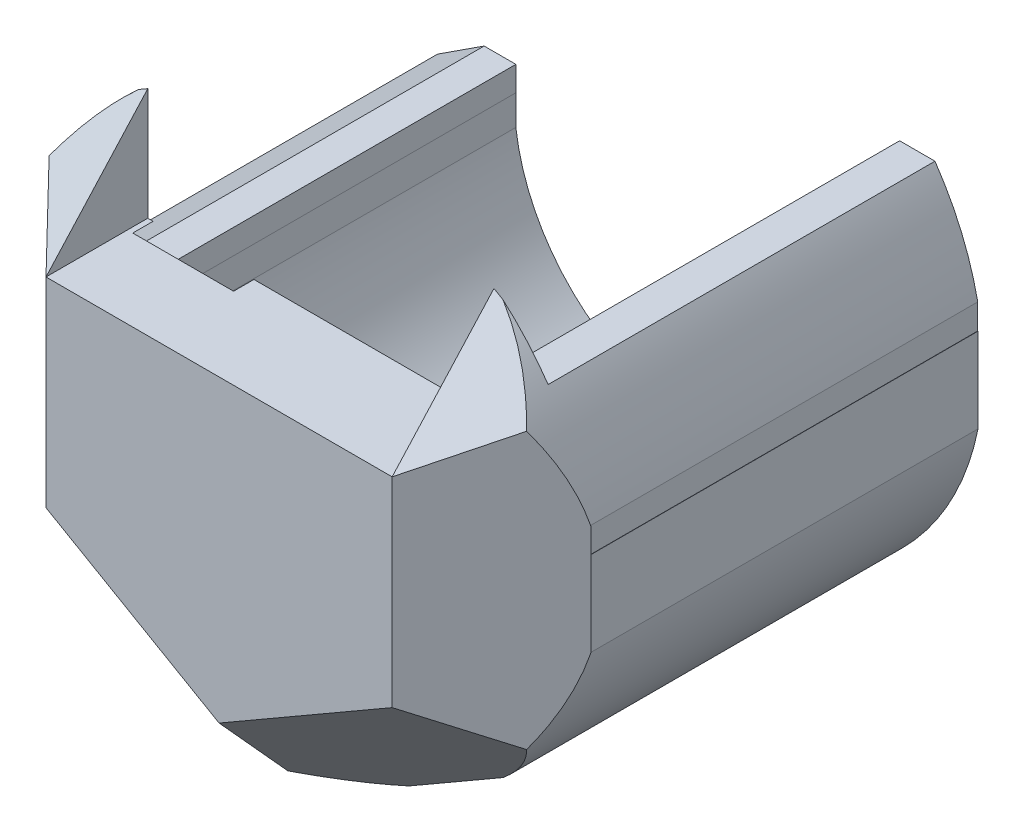
ISO-10303-21;
HEADER;
FILE_DESCRIPTION(('STEP AP214'),'2;1');
FILE_NAME('part.step','',(''),(''),'','','');
FILE_SCHEMA(('AUTOMOTIVE_DESIGN { 1 0 10303 214 1 1 1 1 }'));
ENDSEC;
DATA;
#1=APPLICATION_CONTEXT('core data for automotive mechanical design processes');
#2=APPLICATION_PROTOCOL_DEFINITION('international standard','automotive_design',2000,#1);
#3=PRODUCT_CONTEXT('',#1,'mechanical');
#4=PRODUCT('Part','Part','',(#3));
#5=PRODUCT_RELATED_PRODUCT_CATEGORY('part','',(#4));
#6=PRODUCT_DEFINITION_FORMATION('','',#4);
#7=PRODUCT_DEFINITION_CONTEXT('part definition',#1,'design');
#8=PRODUCT_DEFINITION('design','',#6,#7);
#9=PRODUCT_DEFINITION_SHAPE('','',#8);
#10=(LENGTH_UNIT() NAMED_UNIT(*) SI_UNIT(.MILLI.,.METRE.));
#11=(NAMED_UNIT(*) PLANE_ANGLE_UNIT() SI_UNIT($,.RADIAN.));
#12=(NAMED_UNIT(*) SI_UNIT($,.STERADIAN.) SOLID_ANGLE_UNIT());
#13=UNCERTAINTY_MEASURE_WITH_UNIT(LENGTH_MEASURE(1.E-05),#10,'distance_accuracy_value','');
#14=(GEOMETRIC_REPRESENTATION_CONTEXT(3) GLOBAL_UNCERTAINTY_ASSIGNED_CONTEXT((#13)) GLOBAL_UNIT_ASSIGNED_CONTEXT((#10,
#11,#12)) REPRESENTATION_CONTEXT('',''));
#15=CARTESIAN_POINT('',(0.,0.,0.));
#16=DIRECTION('',(0.,0.,1.));
#17=DIRECTION('',(1.,0.,0.));
#18=AXIS2_PLACEMENT_3D('',#15,#16,#17);
#19=CARTESIAN_POINT('',(0.,0.,0.));
#20=DIRECTION('',(0.,0.,1.));
#21=DIRECTION('',(1.,0.,0.));
#22=AXIS2_PLACEMENT_3D('',#19,#20,#21);
#23=PLANE('',#22);
#24=CARTESIAN_POINT('',(0.,0.,0.));
#25=DIRECTION('',(0.,0.,1.));
#26=DIRECTION('',(1.,0.,0.));
#27=AXIS2_PLACEMENT_3D('',#24,#25,#26);
#28=CIRCLE('',#27,13.5381596898551);
#29=CARTESIAN_POINT('',(13.2604441828742,2.72807402042074,0.));
#30=VERTEX_POINT('',#29);
#31=CARTESIAN_POINT('',(11.160559995125,7.66313698058651,0.));
#32=VERTEX_POINT('',#31);
#33=EDGE_CURVE('E257',#30,#32,#28,.T.);
#34=ORIENTED_EDGE('',*,*,#33,.F.);
#35=DIRECTION('',(0.,-1.,0.));
#36=VECTOR('',#35,1.);
#37=CARTESIAN_POINT('',(13.2604441828743,7.66313698058651,0.));
#38=LINE('',#37,#36);
#39=CARTESIAN_POINT('',(13.2604441828742,1.49032950457588,0.));
#40=VERTEX_POINT('',#39);
#41=EDGE_CURVE('E253',#30,#40,#38,.T.);
#42=ORIENTED_EDGE('',*,*,#41,.T.);
#43=DIRECTION('',(-1.,0.,0.));
#44=VECTOR('',#43,1.);
#45=CARTESIAN_POINT('',(9.42346744244318,1.4903295045759,0.));
#46=LINE('',#45,#44);
#47=CARTESIAN_POINT('',(13.2729425957357,1.4903295045759,0.));
#48=VERTEX_POINT('',#47);
#49=EDGE_CURVE('E594',#48,#40,#46,.T.);
#50=ORIENTED_EDGE('',*,*,#49,.F.);
#51=DIRECTION('',(0.,1.,0.));
#52=VECTOR('',#51,1.);
#53=CARTESIAN_POINT('',(13.2729425957357,-7.66313698058642,0.));
#54=LINE('',#53,#52);
#55=CARTESIAN_POINT('',(13.2729425957357,-2.66660132721843,0.));
#56=VERTEX_POINT('',#55);
#57=EDGE_CURVE('E596',#56,#48,#54,.T.);
#58=ORIENTED_EDGE('',*,*,#57,.F.);
#59=CARTESIAN_POINT('',(0.,0.,0.));
#60=DIRECTION('',(0.,0.,1.));
#61=DIRECTION('',(-1.,0.,0.));
#62=AXIS2_PLACEMENT_3D('',#59,#60,#61);
#63=CIRCLE('',#62,13.5381596898551);
#64=CARTESIAN_POINT('',(8.94581578900438,-10.1614048072704,0.));
#65=VERTEX_POINT('',#64);
#66=EDGE_CURVE('E992',#65,#56,#63,.T.);
#67=ORIENTED_EDGE('',*,*,#66,.F.);
#68=DIRECTION('',(0.866025403784438,0.500000000000001,0.));
#69=VECTOR('',#68,1.);
#70=CARTESIAN_POINT('',(0.,-15.3262739611729,0.));
#71=LINE('',#70,#69);
#72=CARTESIAN_POINT('',(4.32712680673132,-12.8280061344889,0.));
#73=VERTEX_POINT('',#72);
#74=EDGE_CURVE('E598',#73,#65,#71,.T.);
#75=ORIENTED_EDGE('',*,*,#74,.F.);
#76=CARTESIAN_POINT('',(-4.32712680673148,-12.8280061344889,0.));
#77=VERTEX_POINT('',#76);
#78=EDGE_CURVE('E701',#77,#73,#63,.T.);
#79=ORIENTED_EDGE('',*,*,#78,.F.);
#80=DIRECTION('',(0.866025403784441,-0.499999999999995,0.));
#81=VECTOR('',#80,1.);
#82=CARTESIAN_POINT('',(-13.2729425957356,-7.6631369805866,0.));
#83=LINE('',#82,#81);
#84=CARTESIAN_POINT('',(-8.94581578900411,-10.1614048072706,0.));
#85=VERTEX_POINT('',#84);
#86=EDGE_CURVE('E600',#85,#77,#83,.T.);
#87=ORIENTED_EDGE('',*,*,#86,.F.);
#88=CARTESIAN_POINT('',(-13.2729425957356,-2.66660132721866,0.));
#89=VERTEX_POINT('',#88);
#90=EDGE_CURVE('E997',#89,#85,#63,.T.);
#91=ORIENTED_EDGE('',*,*,#90,.F.);
#92=DIRECTION('',(0.,-1.,0.));
#93=VECTOR('',#92,1.);
#94=CARTESIAN_POINT('',(-13.2729425957357,-1.38212943083818E-13,0.));
#95=LINE('',#94,#93);
#96=CARTESIAN_POINT('',(-13.2729425957357,-1.38212943083818E-13,0.));
#97=VERTEX_POINT('',#96);
#98=EDGE_CURVE('E467',#97,#89,#95,.T.);
#99=ORIENTED_EDGE('',*,*,#98,.F.);
#100=DIRECTION('',(-0.838275285606039,-0.545247233410784,0.));
#101=VECTOR('',#100,1.);
#102=CARTESIAN_POINT('',(-13.2729425957357,-1.38212943083818E-13,0.));
#103=LINE('',#102,#101);
#104=CARTESIAN_POINT('',(-10.9816766991981,1.4903295045759,0.));
#105=VERTEX_POINT('',#104);
#106=EDGE_CURVE('E506',#105,#97,#103,.T.);
#107=ORIENTED_EDGE('',*,*,#106,.F.);
#108=DIRECTION('',(-1.,0.,0.));
#109=VECTOR('',#108,1.);
#110=CARTESIAN_POINT('',(-9.42346744244318,1.4903295045759,0.));
#111=LINE('',#110,#109);
#112=CARTESIAN_POINT('',(-9.42346744244318,1.4903295045759,0.));
#113=VERTEX_POINT('',#112);
#114=EDGE_CURVE('E566',#113,#105,#111,.T.);
#115=ORIENTED_EDGE('',*,*,#114,.F.);
#116=DIRECTION('',(-0.00448306408674594,0.999989951017706,0.));
#117=VECTOR('',#116,1.);
#118=CARTESIAN_POINT('',(-9.41807048566655,0.286487123946724,0.));
#119=LINE('',#118,#117);
#120=CARTESIAN_POINT('',(-9.41807048566655,0.286487123946724,0.));
#121=VERTEX_POINT('',#120);
#122=EDGE_CURVE('E568',#121,#113,#119,.T.);
#123=ORIENTED_EDGE('',*,*,#122,.F.);
#124=DIRECTION('',(0.00448306408674817,0.999989951017706,0.));
#125=VECTOR('',#124,1.);
#126=CARTESIAN_POINT('',(-9.41807048566655,0.286487123946724,0.));
#127=LINE('',#126,#125);
#128=CARTESIAN_POINT('',(-9.42470630972269,-1.19369634977802,0.));
#129=VERTEX_POINT('',#128);
#130=EDGE_CURVE('E583',#129,#121,#127,.T.);
#131=ORIENTED_EDGE('',*,*,#130,.F.);
#132=CARTESIAN_POINT('',(0.,0.,0.));
#133=DIRECTION('',(0.,0.,-1.));
#134=DIRECTION('',(1.,0.,0.));
#135=AXIS2_PLACEMENT_3D('',#132,#133,#134);
#136=CIRCLE('',#135,9.5);
#137=CARTESIAN_POINT('',(9.41096902958176,-1.29755998869144,0.));
#138=VERTEX_POINT('',#137);
#139=EDGE_CURVE('E588',#138,#129,#136,.T.);
#140=ORIENTED_EDGE('',*,*,#139,.F.);
#141=DIRECTION('',(-0.00448306408674953,-0.999989951017706,0.));
#142=VECTOR('',#141,1.);
#143=CARTESIAN_POINT('',(9.41807048566655,0.286487123946724,0.));
#144=LINE('',#143,#142);
#145=CARTESIAN_POINT('',(9.42346744244318,1.49032950457588,0.));
#146=VERTEX_POINT('',#145);
#147=EDGE_CURVE('E590',#146,#138,#144,.T.);
#148=ORIENTED_EDGE('',*,*,#147,.F.);
#149=DIRECTION('',(0.,-1.,0.));
#150=VECTOR('',#149,1.);
#151=CARTESIAN_POINT('',(9.42346744244318,7.66313698058651,0.));
#152=LINE('',#151,#150);
#153=CARTESIAN_POINT('',(9.42346744244318,7.66313698058651,0.));
#154=VERTEX_POINT('',#153);
#155=EDGE_CURVE('E275',#154,#146,#152,.T.);
#156=ORIENTED_EDGE('',*,*,#155,.F.);
#157=DIRECTION('',(-1.,0.,0.));
#158=VECTOR('',#157,1.);
#159=CARTESIAN_POINT('',(13.2604441828743,7.66313698058651,0.));
#160=LINE('',#159,#158);
#161=EDGE_CURVE('E725',#32,#154,#160,.T.);
#162=ORIENTED_EDGE('',*,*,#161,.F.);
#163=EDGE_LOOP('',(#34,#42,#50,#58,#67,#75,#79,#87,#91,#99,#107,#115,#123,#131,#140,#148,#156,#162));
#164=FACE_BOUND('',#163,.T.);
#165=ADVANCED_FACE('F46',(#164),#23,.F.);
#166=CARTESIAN_POINT('',(13.2604441828743,7.66313698058651,19.));
#167=DIRECTION('',(-1.,0.,0.));
#168=DIRECTION('',(0.,-1.,0.));
#169=AXIS2_PLACEMENT_3D('',#166,#167,#168);
#170=PLANE('',#169);
#171=DIRECTION('',(0.,0.,1.));
#172=VECTOR('',#171,1.);
#173=CARTESIAN_POINT('',(13.2604441828742,2.72807402042074,-1.));
#174=LINE('',#173,#172);
#175=CARTESIAN_POINT('',(13.2604441828743,2.72807402042072,19.));
#176=VERTEX_POINT('',#175);
#177=EDGE_CURVE('E246',#176,#30,#174,.F.);
#178=ORIENTED_EDGE('',*,*,#177,.F.);
#179=DIRECTION('',(0.,-1.,0.));
#180=VECTOR('',#179,1.);
#181=CARTESIAN_POINT('',(13.2604441828743,7.66313698058651,19.));
#182=LINE('',#181,#180);
#183=CARTESIAN_POINT('',(13.2604441828742,1.49032950457588,19.));
#184=VERTEX_POINT('',#183);
#185=EDGE_CURVE('E251',#176,#184,#182,.T.);
#186=ORIENTED_EDGE('',*,*,#185,.T.);
#187=DIRECTION('',(0.,0.,-1.));
#188=VECTOR('',#187,1.);
#189=CARTESIAN_POINT('',(13.2604441828742,1.49032950457588,19.));
#190=LINE('',#189,#188);
#191=EDGE_CURVE('E720',#184,#40,#190,.T.);
#192=ORIENTED_EDGE('',*,*,#191,.T.);
#193=ORIENTED_EDGE('',*,*,#41,.F.);
#194=EDGE_LOOP('',(#178,#186,#192,#193));
#195=FACE_BOUND('',#194,.T.);
#196=ADVANCED_FACE('F248',(#195),#170,.F.);
#197=CARTESIAN_POINT('',(0.,7.66313698058651,0.));
#198=DIRECTION('',(0.,1.,0.));
#199=DIRECTION('',(-1.,0.,0.));
#200=AXIS2_PLACEMENT_3D('',#197,#198,#199);
#201=PLANE('',#200);
#202=DIRECTION('',(1.,0.,0.));
#203=VECTOR('',#202,1.);
#204=CARTESIAN_POINT('',(13.2604441828743,7.66313698058651,19.));
#205=LINE('',#204,#203);
#206=CARTESIAN_POINT('',(9.42346744244318,7.66313698058651,19.));
#207=VERTEX_POINT('',#206);
#208=CARTESIAN_POINT('',(11.160559995125,7.66313698058651,19.));
#209=VERTEX_POINT('',#208);
#210=EDGE_CURVE('E723',#207,#209,#205,.T.);
#211=ORIENTED_EDGE('',*,*,#210,.T.);
#212=DIRECTION('',(0.,0.,1.));
#213=VECTOR('',#212,1.);
#214=CARTESIAN_POINT('',(11.160559995125,7.66313698058651,-1.));
#215=LINE('',#214,#213);
#216=EDGE_CURVE('E1017',#209,#32,#215,.F.);
#217=ORIENTED_EDGE('',*,*,#216,.T.);
#218=ORIENTED_EDGE('',*,*,#161,.T.);
#219=DIRECTION('',(0.,0.,1.));
#220=VECTOR('',#219,1.);
#221=CARTESIAN_POINT('',(9.42346744244318,7.66313698058651,19.));
#222=LINE('',#221,#220);
#223=EDGE_CURVE('E721',#154,#207,#222,.T.);
#224=ORIENTED_EDGE('',*,*,#223,.T.);
#225=EDGE_LOOP('',(#211,#217,#218,#224));
#226=FACE_BOUND('',#225,.T.);
#227=ADVANCED_FACE('F432',(#226),#201,.T.);
#228=CARTESIAN_POINT('',(0.,0.,19.));
#229=DIRECTION('',(0.,0.,1.));
#230=DIRECTION('',(1.,0.,0.));
#231=AXIS2_PLACEMENT_3D('',#228,#229,#230);
#232=PLANE('',#231);
#233=CARTESIAN_POINT('',(0.,0.,19.));
#234=DIRECTION('',(0.,0.,-1.));
#235=DIRECTION('',(-1.,0.,0.));
#236=AXIS2_PLACEMENT_3D('',#233,#234,#235);
#237=CIRCLE('',#236,13.5381596898551);
#238=CARTESIAN_POINT('',(13.2729425957356,2.66660132721863,19.));
#239=VERTEX_POINT('',#238);
#240=EDGE_CURVE('E256',#176,#239,#237,.T.);
#241=ORIENTED_EDGE('',*,*,#240,.T.);
#242=DIRECTION('',(0.,1.,0.));
#243=VECTOR('',#242,1.);
#244=CARTESIAN_POINT('',(13.2729425957357,-7.66313698058642,19.));
#245=LINE('',#244,#243);
#246=CARTESIAN_POINT('',(13.2729425957357,1.4903295045759,19.));
#247=VERTEX_POINT('',#246);
#248=EDGE_CURVE('E320',#247,#239,#245,.T.);
#249=ORIENTED_EDGE('',*,*,#248,.F.);
#250=DIRECTION('',(-1.,0.,0.));
#251=VECTOR('',#250,1.);
#252=CARTESIAN_POINT('',(9.42346744244318,1.4903295045759,19.));
#253=LINE('',#252,#251);
#254=EDGE_CURVE('E271',#247,#184,#253,.T.);
#255=ORIENTED_EDGE('',*,*,#254,.T.);
#256=ORIENTED_EDGE('',*,*,#185,.F.);
#257=EDGE_LOOP('',(#241,#249,#255,#256));
#258=FACE_BOUND('',#257,.T.);
#259=ADVANCED_FACE('F269',(#258),#232,.F.);
#260=CARTESIAN_POINT('',(8.94581578900455,10.1614048072702,19.));
#261=VERTEX_POINT('',#260);
#262=EDGE_CURVE('E266',#261,#209,#237,.T.);
#263=ORIENTED_EDGE('',*,*,#262,.T.);
#264=ORIENTED_EDGE('',*,*,#210,.F.);
#265=DIRECTION('',(0.,-1.,0.));
#266=VECTOR('',#265,1.);
#267=CARTESIAN_POINT('',(9.42346744244318,7.66313698058651,19.));
#268=LINE('',#267,#266);
#269=CARTESIAN_POINT('',(9.42346744244318,1.49032950457588,19.));
#270=VERTEX_POINT('',#269);
#271=EDGE_CURVE('E72',#207,#270,#268,.T.);
#272=ORIENTED_EDGE('',*,*,#271,.T.);
#273=DIRECTION('',(-0.00448306408674594,-0.999989951017706,0.));
#274=VECTOR('',#273,1.);
#275=CARTESIAN_POINT('',(9.41807048566655,0.286487123946724,19.));
#276=LINE('',#275,#274);
#277=CARTESIAN_POINT('',(9.41096902958176,-1.29755998869144,19.));
#278=VERTEX_POINT('',#277);
#279=EDGE_CURVE('E452',#270,#278,#276,.T.);
#280=ORIENTED_EDGE('',*,*,#279,.T.);
#281=CARTESIAN_POINT('',(0.,0.,19.));
#282=DIRECTION('',(0.,0.,-1.));
#283=DIRECTION('',(1.,0.,0.));
#284=AXIS2_PLACEMENT_3D('',#281,#282,#283);
#285=CIRCLE('',#284,9.5);
#286=CARTESIAN_POINT('',(-8.08361083529306,-4.99051458905118,19.));
#287=VERTEX_POINT('',#286);
#288=EDGE_CURVE('E455',#278,#287,#285,.T.);
#289=ORIENTED_EDGE('',*,*,#288,.T.);
#290=CARTESIAN_POINT('',(-5.76292213627995,-0.00409262914115305,19.));
#291=DIRECTION('',(0.,0.,-1.));
#292=DIRECTION('',(-1.,0.,0.));
#293=AXIS2_PLACEMENT_3D('',#290,#291,#292);
#294=CIRCLE('',#293,5.50000000000001);
#295=CARTESIAN_POINT('',(-3.28774922354522,4.90747728811182,19.));
#296=VERTEX_POINT('',#295);
#297=EDGE_CURVE('E284',#296,#287,#294,.T.);
#298=ORIENTED_EDGE('',*,*,#297,.F.);
#299=DIRECTION('',(1.,0.,0.));
#300=VECTOR('',#299,1.);
#301=CARTESIAN_POINT('',(-8.5,4.90747728811182,19.));
#302=LINE('',#301,#300);
#303=CARTESIAN_POINT('',(8.5,4.90747728811182,19.));
#304=VERTEX_POINT('',#303);
#305=EDGE_CURVE('E292',#296,#304,#302,.T.);
#306=ORIENTED_EDGE('',*,*,#305,.T.);
#307=DIRECTION('',(0.,1.,0.));
#308=VECTOR('',#307,1.);
#309=CARTESIAN_POINT('',(8.5,4.90747728811182,19.));
#310=LINE('',#309,#308);
#311=CARTESIAN_POINT('',(8.5,10.4187966730611,19.));
#312=VERTEX_POINT('',#311);
#313=EDGE_CURVE('E291',#304,#312,#310,.T.);
#314=ORIENTED_EDGE('',*,*,#313,.T.);
#315=DIRECTION('',(-0.866025403784441,0.499999999999995,0.));
#316=VECTOR('',#315,1.);
#317=CARTESIAN_POINT('',(13.2729425957356,7.66313698058651,19.));
#318=LINE('',#317,#316);
#319=EDGE_CURVE('E495',#261,#312,#318,.T.);
#320=ORIENTED_EDGE('',*,*,#319,.F.);
#321=EDGE_LOOP('',(#263,#264,#272,#280,#289,#298,#306,#314,#320));
#322=FACE_BOUND('',#321,.T.);
#323=ADVANCED_FACE('F431',(#322),#232,.F.);
#324=CARTESIAN_POINT('',(-13.2729425957357,2.66660132721852,19.));
#325=VERTEX_POINT('',#324);
#326=CARTESIAN_POINT('',(-8.94581578900459,10.1614048072702,19.));
#327=VERTEX_POINT('',#326);
#328=EDGE_CURVE('E64',#325,#327,#237,.T.);
#329=ORIENTED_EDGE('',*,*,#328,.T.);
#330=DIRECTION('',(-0.866025403784434,-0.500000000000007,0.));
#331=VECTOR('',#330,1.);
#332=CARTESIAN_POINT('',(-1.07022799058865E-13,15.3262739611729,19.));
#333=LINE('',#332,#331);
#334=CARTESIAN_POINT('',(-8.5,10.418796673061,19.));
#335=VERTEX_POINT('',#334);
#336=EDGE_CURVE('E492',#335,#327,#333,.T.);
#337=ORIENTED_EDGE('',*,*,#336,.F.);
#338=DIRECTION('',(0.,-1.,0.));
#339=VECTOR('',#338,1.);
#340=CARTESIAN_POINT('',(-8.5,4.90747728811182,19.));
#341=LINE('',#340,#339);
#342=CARTESIAN_POINT('',(-8.5,4.90747728811182,19.));
#343=VERTEX_POINT('',#342);
#344=EDGE_CURVE('E295',#335,#343,#341,.T.);
#345=ORIENTED_EDGE('',*,*,#344,.T.);
#346=CARTESIAN_POINT('',(-8.23809504901468,4.90747728811182,19.));
#347=VERTEX_POINT('',#346);
#348=EDGE_CURVE('E288',#343,#347,#302,.T.);
#349=ORIENTED_EDGE('',*,*,#348,.T.);
#350=CARTESIAN_POINT('',(-11.0722899429276,1.43139108505875,19.));
#351=VERTEX_POINT('',#350);
#352=EDGE_CURVE('E282',#351,#347,#294,.T.);
#353=ORIENTED_EDGE('',*,*,#352,.F.);
#354=DIRECTION('',(-0.838275285606039,-0.545247233410784,0.));
#355=VECTOR('',#354,1.);
#356=CARTESIAN_POINT('',(-13.2729425957357,-1.38212943083818E-13,19.));
#357=LINE('',#356,#355);
#358=CARTESIAN_POINT('',(-13.2729425957357,-1.41596803726607E-13,19.));
#359=VERTEX_POINT('',#358);
#360=EDGE_CURVE('E464',#351,#359,#357,.T.);
#361=ORIENTED_EDGE('',*,*,#360,.T.);
#362=DIRECTION('',(0.,-1.,0.));
#363=VECTOR('',#362,1.);
#364=CARTESIAN_POINT('',(-13.2729425957358,7.66313698058632,19.));
#365=LINE('',#364,#363);
#366=EDGE_CURVE('E50',#325,#359,#365,.T.);
#367=ORIENTED_EDGE('',*,*,#366,.F.);
#368=EDGE_LOOP('',(#329,#337,#345,#349,#353,#361,#367));
#369=FACE_BOUND('',#368,.T.);
#370=ADVANCED_FACE('F433',(#369),#232,.F.);
#371=CARTESIAN_POINT('',(-8.21721419997254,14.2326324910289,15.688116669333));
#372=DIRECTION('',(0.361669992811895,-0.626430803123272,-0.690492045716514));
#373=DIRECTION('',(0.,0.740627981798533,-0.671915316522128));
#374=AXIS2_PLACEMENT_3D('',#371,#372,#373);
#375=PLANE('',#374);
#376=CARTESIAN_POINT('',(0.,0.,32.9043601819078));
#377=DIRECTION('',(0.361669992811895,-0.626430803123272,-0.690492045716514));
#378=DIRECTION('',(-0.345246022858257,0.597983652701587,-0.723339985623789));
#379=AXIS2_PLACEMENT_3D('',#376,#377,#378);
#380=ELLIPSE('',#379,19.606539675351,13.5381596898551);
#381=CARTESIAN_POINT('',(-11.7243902119051,6.7690798449275,20.6222197866094));
#382=VERTEX_POINT('',#381);
#383=EDGE_CURVE('E990',#382,#327,#380,.T.);
#384=ORIENTED_EDGE('',*,*,#383,.F.);
#385=DIRECTION('',(0.641402646991142,-0.370313990899252,0.671915316522123));
#386=VECTOR('',#385,1.);
#387=CARTESIAN_POINT('',(-13.2729425957358,7.66313698058632,19.));
#388=LINE('',#387,#386);
#389=CARTESIAN_POINT('',(-8.5,4.90747728811182,24.));
#390=VERTEX_POINT('',#389);
#391=EDGE_CURVE('E677',#382,#390,#388,.T.);
#392=ORIENTED_EDGE('',*,*,#391,.T.);
#393=DIRECTION('',(0.,0.740627981798533,-0.671915316522128));
#394=VECTOR('',#393,1.);
#395=CARTESIAN_POINT('',(-8.5,14.1589225518986,15.6068688660546));
#396=LINE('',#395,#394);
#397=EDGE_CURVE('E315',#390,#335,#396,.T.);
#398=ORIENTED_EDGE('',*,*,#397,.T.);
#399=ORIENTED_EDGE('',*,*,#336,.T.);
#400=EDGE_LOOP('',(#384,#392,#398,#399));
#401=FACE_BOUND('',#400,.T.);
#402=ADVANCED_FACE('F436',(#401),#375,.F.);
#403=CARTESIAN_POINT('',(8.21721419997253,14.2326324910289,15.688116669333));
#404=DIRECTION('',(-0.361669992811894,-0.626430803123271,-0.690492045716515));
#405=DIRECTION('',(0.,0.740627981798534,-0.671915316522127));
#406=AXIS2_PLACEMENT_3D('',#403,#404,#405);
#407=PLANE('',#406);
#408=CARTESIAN_POINT('',(0.,0.,32.9043601819078));
#409=DIRECTION('',(-0.361669992811894,-0.626430803123271,-0.690492045716515));
#410=DIRECTION('',(0.345246022858257,0.597983652701588,-0.723339985623788));
#411=AXIS2_PLACEMENT_3D('',#408,#409,#410);
#412=ELLIPSE('',#411,19.606539675351,13.5381596898551);
#413=CARTESIAN_POINT('',(11.724390211905,6.7690798449276,20.6222197866094));
#414=VERTEX_POINT('',#413);
#415=EDGE_CURVE('E1004',#261,#414,#412,.T.);
#416=ORIENTED_EDGE('',*,*,#415,.F.);
#417=ORIENTED_EDGE('',*,*,#319,.T.);
#418=DIRECTION('',(0.,-0.740627981798534,0.671915316522127));
#419=VECTOR('',#418,1.);
#420=CARTESIAN_POINT('',(8.5,14.1589225518986,15.6068688660546));
#421=LINE('',#420,#419);
#422=CARTESIAN_POINT('',(8.5,4.90747728811182,24.));
#423=VERTEX_POINT('',#422);
#424=EDGE_CURVE('E310',#312,#423,#421,.T.);
#425=ORIENTED_EDGE('',*,*,#424,.T.);
#426=DIRECTION('',(-0.641402646991128,-0.370313990899277,0.671915316522123));
#427=VECTOR('',#426,1.);
#428=CARTESIAN_POINT('',(13.2729425957356,7.66313698058651,19.));
#429=LINE('',#428,#427);
#430=EDGE_CURVE('E482',#414,#423,#429,.T.);
#431=ORIENTED_EDGE('',*,*,#430,.F.);
#432=EDGE_LOOP('',(#416,#417,#425,#431));
#433=FACE_BOUND('',#432,.T.);
#434=ADVANCED_FACE('F341',(#433),#407,.F.);
#435=CARTESIAN_POINT('',(-16.4344283999451,0.,15.6881166693329));
#436=DIRECTION('',(0.723339985623791,0.,-0.690492045716512));
#437=DIRECTION('',(-0.690492045716512,0.,-0.723339985623791));
#438=AXIS2_PLACEMENT_3D('',#435,#436,#437);
#439=PLANE('',#438);
#440=CARTESIAN_POINT('',(0.,0.,32.9043601819079));
#441=DIRECTION('',(0.723339985623791,0.,-0.690492045716512));
#442=DIRECTION('',(-0.690492045716512,0.,-0.723339985623791));
#443=AXIS2_PLACEMENT_3D('',#440,#441,#442);
#444=ELLIPSE('',#443,19.6065396753511,13.5381596898551);
#445=EDGE_CURVE('E986',#325,#382,#444,.T.);
#446=ORIENTED_EDGE('',*,*,#445,.F.);
#447=ORIENTED_EDGE('',*,*,#366,.T.);
#448=DIRECTION('',(0.,1.,0.));
#449=VECTOR('',#448,1.);
#450=CARTESIAN_POINT('',(-13.2729425957357,0.,18.9999999999999));
#451=LINE('',#450,#449);
#452=CARTESIAN_POINT('',(-13.2729425957356,-2.66660132721884,19.));
#453=VERTEX_POINT('',#452);
#454=EDGE_CURVE('E503',#359,#453,#451,.F.);
#455=ORIENTED_EDGE('',*,*,#454,.T.);
#456=CARTESIAN_POINT('',(-11.724390211905,-6.76907984492768,20.6222197866094));
#457=VERTEX_POINT('',#456);
#458=EDGE_CURVE('E982',#457,#453,#444,.T.);
#459=ORIENTED_EDGE('',*,*,#458,.F.);
#460=DIRECTION('',(0.641402646991121,0.37031399089929,0.671915316522123));
#461=VECTOR('',#460,1.);
#462=CARTESIAN_POINT('',(-13.2729425957356,-7.6631369805866,19.));
#463=LINE('',#462,#461);
#464=CARTESIAN_POINT('',(-8.5,-4.90747728811182,24.));
#465=VERTEX_POINT('',#464);
#466=EDGE_CURVE('E679',#457,#465,#463,.T.);
#467=ORIENTED_EDGE('',*,*,#466,.T.);
#468=DIRECTION('',(0.,-1.,0.));
#469=VECTOR('',#468,1.);
#470=CARTESIAN_POINT('',(-8.5,4.90747728811182,24.));
#471=LINE('',#470,#469);
#472=EDGE_CURVE('E606',#390,#465,#471,.T.);
#473=ORIENTED_EDGE('',*,*,#472,.F.);
#474=ORIENTED_EDGE('',*,*,#391,.F.);
#475=EDGE_LOOP('',(#446,#447,#455,#459,#467,#473,#474));
#476=FACE_BOUND('',#475,.T.);
#477=ADVANCED_FACE('F330',(#476),#439,.F.);
#478=CARTESIAN_POINT('',(-8.21721419997251,-14.2326324910288,15.6881166693332));
#479=DIRECTION('',(0.361669992811892,0.626430803123268,-0.690492045716519));
#480=DIRECTION('',(0.,0.740627981798538,0.671915316522123));
#481=AXIS2_PLACEMENT_3D('',#478,#479,#480);
#482=PLANE('',#481);
#483=CARTESIAN_POINT('',(0.,0.,32.9043601819077));
#484=DIRECTION('',(0.361669992811892,0.626430803123268,-0.690492045716519));
#485=DIRECTION('',(-0.34524602285826,-0.597983652701592,-0.723339985623784));
#486=AXIS2_PLACEMENT_3D('',#483,#484,#485);
#487=ELLIPSE('',#486,19.6065396753509,13.5381596898551);
#488=CARTESIAN_POINT('',(-8.94581578900431,-10.1614048072705,19.));
#489=VERTEX_POINT('',#488);
#490=EDGE_CURVE('E985',#489,#457,#487,.T.);
#491=ORIENTED_EDGE('',*,*,#490,.F.);
#492=DIRECTION('',(0.86602540378444,-0.499999999999998,0.));
#493=VECTOR('',#492,1.);
#494=CARTESIAN_POINT('',(-13.2729425957356,-7.66313698058656,19.));
#495=LINE('',#494,#493);
#496=CARTESIAN_POINT('',(-4.32712680673137,-12.8280061344889,19.));
#497=VERTEX_POINT('',#496);
#498=EDGE_CURVE('E491',#489,#497,#495,.T.);
#499=ORIENTED_EDGE('',*,*,#498,.T.);
#500=CARTESIAN_POINT('',(0.,-13.5381596898551,20.6222197866094));
#501=VERTEX_POINT('',#500);
#502=EDGE_CURVE('E690',#501,#497,#487,.T.);
#503=ORIENTED_EDGE('',*,*,#502,.F.);
#504=DIRECTION('',(0.,0.740627981798538,0.671915316522123));
#505=VECTOR('',#504,1.);
#506=CARTESIAN_POINT('',(0.,-15.3262739611729,19.));
#507=LINE('',#506,#505);
#508=CARTESIAN_POINT('',(0.,-9.81495457622364,24.));
#509=VERTEX_POINT('',#508);
#510=EDGE_CURVE('E681',#501,#509,#507,.T.);
#511=ORIENTED_EDGE('',*,*,#510,.T.);
#512=DIRECTION('',(0.866025403784439,-0.5,0.));
#513=VECTOR('',#512,1.);
#514=CARTESIAN_POINT('',(-8.5,-4.90747728811182,24.));
#515=LINE('',#514,#513);
#516=EDGE_CURVE('E364',#465,#509,#515,.T.);
#517=ORIENTED_EDGE('',*,*,#516,.F.);
#518=ORIENTED_EDGE('',*,*,#466,.F.);
#519=EDGE_LOOP('',(#491,#499,#503,#511,#517,#518));
#520=FACE_BOUND('',#519,.T.);
#521=ADVANCED_FACE('F340',(#520),#482,.F.);
#522=CARTESIAN_POINT('',(8.21721419997252,-14.2326324910288,15.6881166693331));
#523=DIRECTION('',(-0.361669992811893,0.626430803123269,-0.690492045716518));
#524=DIRECTION('',(0.,0.740627981798537,0.671915316522124));
#525=AXIS2_PLACEMENT_3D('',#522,#523,#524);
#526=PLANE('',#525);
#527=CARTESIAN_POINT('',(0.,0.,32.9043601819077));
#528=DIRECTION('',(-0.361669992811893,0.626430803123269,-0.690492045716518));
#529=DIRECTION('',(0.345246022858259,-0.59798365270159,-0.723339985623786));
#530=AXIS2_PLACEMENT_3D('',#527,#528,#529);
#531=ELLIPSE('',#530,19.6065396753509,13.5381596898551);
#532=CARTESIAN_POINT('',(4.3271268067313,-12.8280061344889,19.));
#533=VERTEX_POINT('',#532);
#534=EDGE_CURVE('E691',#533,#501,#531,.T.);
#535=ORIENTED_EDGE('',*,*,#534,.F.);
#536=DIRECTION('',(0.866025403784438,0.500000000000001,0.));
#537=VECTOR('',#536,1.);
#538=CARTESIAN_POINT('',(0.,-15.3262739611729,19.));
#539=LINE('',#538,#537);
#540=CARTESIAN_POINT('',(8.94581578900439,-10.1614048072704,19.));
#541=VERTEX_POINT('',#540);
#542=EDGE_CURVE('E481',#533,#541,#539,.T.);
#543=ORIENTED_EDGE('',*,*,#542,.T.);
#544=CARTESIAN_POINT('',(11.724390211905,-6.76907984492755,20.6222197866094));
#545=VERTEX_POINT('',#544);
#546=EDGE_CURVE('E695',#545,#541,#531,.T.);
#547=ORIENTED_EDGE('',*,*,#546,.F.);
#548=DIRECTION('',(-0.641402646991135,0.370313990899265,0.671915316522123));
#549=VECTOR('',#548,1.);
#550=CARTESIAN_POINT('',(13.2729425957357,-7.66313698058642,19.));
#551=LINE('',#550,#549);
#552=CARTESIAN_POINT('',(8.5,-4.90747728811182,24.));
#553=VERTEX_POINT('',#552);
#554=EDGE_CURVE('E686',#545,#553,#551,.T.);
#555=ORIENTED_EDGE('',*,*,#554,.T.);
#556=DIRECTION('',(0.866025403784439,0.5,0.));
#557=VECTOR('',#556,1.);
#558=CARTESIAN_POINT('',(0.,-9.81495457622364,24.));
#559=LINE('',#558,#557);
#560=EDGE_CURVE('E378',#509,#553,#559,.T.);
#561=ORIENTED_EDGE('',*,*,#560,.F.);
#562=ORIENTED_EDGE('',*,*,#510,.F.);
#563=EDGE_LOOP('',(#535,#543,#547,#555,#561,#562));
#564=FACE_BOUND('',#563,.T.);
#565=ADVANCED_FACE('F384',(#564),#526,.F.);
#566=CARTESIAN_POINT('',(16.4344283999451,0.,15.6881166693331));
#567=DIRECTION('',(-0.723339985623787,0.,-0.690492045716516));
#568=DIRECTION('',(-0.690492045716516,0.,0.723339985623787));
#569=AXIS2_PLACEMENT_3D('',#566,#567,#568);
#570=PLANE('',#569);
#571=CARTESIAN_POINT('',(0.,0.,32.9043601819078));
#572=DIRECTION('',(-0.723339985623787,0.,-0.690492045716516));
#573=DIRECTION('',(0.690492045716516,0.,-0.723339985623787));
#574=AXIS2_PLACEMENT_3D('',#571,#572,#573);
#575=ELLIPSE('',#574,19.6065396753509,13.5381596898551);
#576=CARTESIAN_POINT('',(13.2729425957357,-2.66660132721852,19.));
#577=VERTEX_POINT('',#576);
#578=EDGE_CURVE('E1003',#577,#545,#575,.T.);
#579=ORIENTED_EDGE('',*,*,#578,.F.);
#580=DIRECTION('',(0.,1.,0.));
#581=VECTOR('',#580,1.);
#582=CARTESIAN_POINT('',(13.2729425957357,0.,19.));
#583=LINE('',#582,#581);
#584=EDGE_CURVE('E478',#577,#247,#583,.T.);
#585=ORIENTED_EDGE('',*,*,#584,.T.);
#586=ORIENTED_EDGE('',*,*,#248,.T.);
#587=EDGE_CURVE('E262',#414,#239,#575,.T.);
#588=ORIENTED_EDGE('',*,*,#587,.F.);
#589=ORIENTED_EDGE('',*,*,#430,.T.);
#590=DIRECTION('',(0.,1.,0.));
#591=VECTOR('',#590,1.);
#592=CARTESIAN_POINT('',(8.5,-4.90747728811182,24.));
#593=LINE('',#592,#591);
#594=EDGE_CURVE('E496',#553,#423,#593,.T.);
#595=ORIENTED_EDGE('',*,*,#594,.F.);
#596=ORIENTED_EDGE('',*,*,#554,.F.);
#597=EDGE_LOOP('',(#579,#585,#586,#588,#589,#595,#596));
#598=FACE_BOUND('',#597,.T.);
#599=ADVANCED_FACE('F393',(#598),#570,.F.);
#600=CARTESIAN_POINT('',(9.42346744244318,1.4903295045759,19.));
#601=DIRECTION('',(0.,-1.,0.));
#602=DIRECTION('',(1.,0.,0.));
#603=AXIS2_PLACEMENT_3D('',#600,#601,#602);
#604=PLANE('',#603);
#605=ORIENTED_EDGE('',*,*,#191,.F.);
#606=ORIENTED_EDGE('',*,*,#254,.F.);
#607=DIRECTION('',(0.,0.,-1.));
#608=VECTOR('',#607,1.);
#609=CARTESIAN_POINT('',(13.2729425957357,1.4903295045759,19.));
#610=LINE('',#609,#608);
#611=EDGE_CURVE('E513',#247,#48,#610,.T.);
#612=ORIENTED_EDGE('',*,*,#611,.T.);
#613=ORIENTED_EDGE('',*,*,#49,.T.);
#614=EDGE_LOOP('',(#605,#606,#612,#613));
#615=FACE_BOUND('',#614,.T.);
#616=ADVANCED_FACE('F397',(#615),#604,.F.);
#617=CARTESIAN_POINT('',(-13.2729425957357,-1.38212943083818E-13,19.));
#618=DIRECTION('',(1.,0.,0.));
#619=DIRECTION('',(0.,1.,0.));
#620=AXIS2_PLACEMENT_3D('',#617,#618,#619);
#621=PLANE('',#620);
#622=ORIENTED_EDGE('',*,*,#98,.T.);
#623=DIRECTION('',(0.,0.,-1.));
#624=VECTOR('',#623,1.);
#625=CARTESIAN_POINT('',(-13.2729425957356,-2.66660132721866,19.));
#626=LINE('',#625,#624);
#627=EDGE_CURVE('E718',#89,#453,#626,.F.);
#628=ORIENTED_EDGE('',*,*,#627,.T.);
#629=ORIENTED_EDGE('',*,*,#454,.F.);
#630=DIRECTION('',(0.,0.,-1.));
#631=VECTOR('',#630,1.);
#632=CARTESIAN_POINT('',(-13.2729425957357,-1.38212943083818E-13,19.));
#633=LINE('',#632,#631);
#634=EDGE_CURVE('E532',#359,#97,#633,.T.);
#635=ORIENTED_EDGE('',*,*,#634,.T.);
#636=EDGE_LOOP('',(#622,#628,#629,#635));
#637=FACE_BOUND('',#636,.T.);
#638=ADVANCED_FACE('F48',(#637),#621,.F.);
#639=CARTESIAN_POINT('',(-13.2729425957356,-7.6631369805866,19.));
#640=DIRECTION('',(0.499999999999995,0.866025403784442,0.));
#641=DIRECTION('',(-0.866025403784442,0.499999999999995,0.));
#642=AXIS2_PLACEMENT_3D('',#639,#640,#641);
#643=PLANE('',#642);
#644=ORIENTED_EDGE('',*,*,#86,.T.);
#645=DIRECTION('',(0.,0.,-1.));
#646=VECTOR('',#645,1.);
#647=CARTESIAN_POINT('',(-4.3271268067315,-12.8280061344889,19.));
#648=LINE('',#647,#646);
#649=EDGE_CURVE('E713',#77,#497,#648,.F.);
#650=ORIENTED_EDGE('',*,*,#649,.T.);
#651=ORIENTED_EDGE('',*,*,#498,.F.);
#652=DIRECTION('',(0.,0.,-1.));
#653=VECTOR('',#652,1.);
#654=CARTESIAN_POINT('',(-8.94581578900409,-10.1614048072706,19.));
#655=LINE('',#654,#653);
#656=EDGE_CURVE('E711',#489,#85,#655,.T.);
#657=ORIENTED_EDGE('',*,*,#656,.T.);
#658=EDGE_LOOP('',(#644,#650,#651,#657));
#659=FACE_BOUND('',#658,.T.);
#660=ADVANCED_FACE('F745',(#659),#643,.F.);
#661=CARTESIAN_POINT('',(0.,-15.3262739611729,19.));
#662=DIRECTION('',(-0.500000000000001,0.866025403784438,0.));
#663=DIRECTION('',(-0.866025403784438,-0.500000000000001,0.));
#664=AXIS2_PLACEMENT_3D('',#661,#662,#663);
#665=PLANE('',#664);
#666=ORIENTED_EDGE('',*,*,#74,.T.);
#667=DIRECTION('',(0.,0.,-1.));
#668=VECTOR('',#667,1.);
#669=CARTESIAN_POINT('',(8.94581578900437,-10.1614048072704,19.));
#670=LINE('',#669,#668);
#671=EDGE_CURVE('E704',#65,#541,#670,.F.);
#672=ORIENTED_EDGE('',*,*,#671,.T.);
#673=ORIENTED_EDGE('',*,*,#542,.F.);
#674=DIRECTION('',(0.,0.,-1.));
#675=VECTOR('',#674,1.);
#676=CARTESIAN_POINT('',(4.32712680673133,-12.8280061344889,19.));
#677=LINE('',#676,#675);
#678=EDGE_CURVE('E698',#533,#73,#677,.T.);
#679=ORIENTED_EDGE('',*,*,#678,.T.);
#680=EDGE_LOOP('',(#666,#672,#673,#679));
#681=FACE_BOUND('',#680,.T.);
#682=ADVANCED_FACE('F708',(#681),#665,.F.);
#683=CARTESIAN_POINT('',(13.2729425957357,-7.66313698058642,19.));
#684=DIRECTION('',(-1.,0.,0.));
#685=DIRECTION('',(0.,-1.,0.));
#686=AXIS2_PLACEMENT_3D('',#683,#684,#685);
#687=PLANE('',#686);
#688=ORIENTED_EDGE('',*,*,#584,.F.);
#689=DIRECTION('',(0.,0.,-1.));
#690=VECTOR('',#689,1.);
#691=CARTESIAN_POINT('',(13.2729425957357,-2.66660132721842,19.));
#692=LINE('',#691,#690);
#693=EDGE_CURVE('E705',#577,#56,#692,.T.);
#694=ORIENTED_EDGE('',*,*,#693,.T.);
#695=ORIENTED_EDGE('',*,*,#57,.T.);
#696=ORIENTED_EDGE('',*,*,#611,.F.);
#697=EDGE_LOOP('',(#688,#694,#695,#696));
#698=FACE_BOUND('',#697,.T.);
#699=ADVANCED_FACE('F731',(#698),#687,.F.);
#700=CARTESIAN_POINT('',(9.41807048566655,0.286487123946724,19.));
#701=DIRECTION('',(0.999989951017706,-0.00448306408674953,0.));
#702=DIRECTION('',(0.00448306408674953,0.999989951017706,0.));
#703=AXIS2_PLACEMENT_3D('',#700,#701,#702);
#704=PLANE('',#703);
#705=ORIENTED_EDGE('',*,*,#147,.T.);
#706=DIRECTION('',(0.,0.,-1.));
#707=VECTOR('',#706,1.);
#708=CARTESIAN_POINT('',(9.41096902958176,-1.29755998869144,19.));
#709=LINE('',#708,#707);
#710=EDGE_CURVE('E523',#278,#138,#709,.T.);
#711=ORIENTED_EDGE('',*,*,#710,.F.);
#712=ORIENTED_EDGE('',*,*,#279,.F.);
#713=DIRECTION('',(0.,0.,-1.));
#714=VECTOR('',#713,1.);
#715=CARTESIAN_POINT('',(9.42346744244318,1.4903295045759,19.));
#716=LINE('',#715,#714);
#717=EDGE_CURVE('E516',#270,#146,#716,.T.);
#718=ORIENTED_EDGE('',*,*,#717,.T.);
#719=EDGE_LOOP('',(#705,#711,#712,#718));
#720=FACE_BOUND('',#719,.T.);
#721=ADVANCED_FACE('F729',(#720),#704,.F.);
#722=CARTESIAN_POINT('',(0.,0.,19.));
#723=DIRECTION('',(0.,0.,-1.));
#724=DIRECTION('',(-1.,0.,0.));
#725=AXIS2_PLACEMENT_3D('',#722,#723,#724);
#726=CYLINDRICAL_SURFACE('',#725,9.5);
#727=ORIENTED_EDGE('',*,*,#139,.T.);
#728=DIRECTION('',(0.,0.,-1.));
#729=VECTOR('',#728,1.);
#730=CARTESIAN_POINT('',(-9.42470630972269,-1.19369634977802,19.));
#731=LINE('',#730,#729);
#732=CARTESIAN_POINT('',(-9.42470630972269,-1.19369634977802,19.));
#733=VERTEX_POINT('',#732);
#734=EDGE_CURVE('E528',#733,#129,#731,.T.);
#735=ORIENTED_EDGE('',*,*,#734,.F.);
#736=CARTESIAN_POINT('',(0.,0.,19.));
#737=DIRECTION('',(0.,0.,-1.));
#738=DIRECTION('',(-1.,0.,0.));
#739=AXIS2_PLACEMENT_3D('',#736,#737,#738);
#740=CIRCLE('',#739,9.5);
#741=EDGE_CURVE('E281',#733,#287,#740,.F.);
#742=ORIENTED_EDGE('',*,*,#741,.T.);
#743=ORIENTED_EDGE('',*,*,#288,.F.);
#744=ORIENTED_EDGE('',*,*,#710,.T.);
#745=EDGE_LOOP('',(#727,#735,#742,#743,#744));
#746=FACE_BOUND('',#745,.T.);
#747=ADVANCED_FACE('F620',(#746),#726,.F.);
#748=CARTESIAN_POINT('',(-9.41807048566655,0.286487123946724,19.));
#749=DIRECTION('',(-0.999989951017706,0.00448306408674817,0.));
#750=DIRECTION('',(-0.00448306408674817,-0.999989951017706,0.));
#751=AXIS2_PLACEMENT_3D('',#748,#749,#750);
#752=PLANE('',#751);
#753=ORIENTED_EDGE('',*,*,#130,.T.);
#754=DIRECTION('',(0.,0.,-1.));
#755=VECTOR('',#754,1.);
#756=CARTESIAN_POINT('',(-9.41807048566655,0.286487123946724,19.));
#757=LINE('',#756,#755);
#758=CARTESIAN_POINT('',(-9.41807048566655,0.286487123946724,19.));
#759=VERTEX_POINT('',#758);
#760=EDGE_CURVE('E574',#759,#121,#757,.T.);
#761=ORIENTED_EDGE('',*,*,#760,.F.);
#762=DIRECTION('',(0.00448306408674817,0.999989951017706,0.));
#763=VECTOR('',#762,1.);
#764=CARTESIAN_POINT('',(-9.41807048566655,0.286487123946724,19.));
#765=LINE('',#764,#763);
#766=EDGE_CURVE('E458',#733,#759,#765,.T.);
#767=ORIENTED_EDGE('',*,*,#766,.F.);
#768=ORIENTED_EDGE('',*,*,#734,.T.);
#769=EDGE_LOOP('',(#753,#761,#767,#768));
#770=FACE_BOUND('',#769,.T.);
#771=ADVANCED_FACE('F581',(#770),#752,.F.);
#772=CARTESIAN_POINT('',(-9.41807048566655,0.286487123946724,19.));
#773=DIRECTION('',(-0.999989951017706,-0.00448306408674594,0.));
#774=DIRECTION('',(0.00448306408674594,-0.999989951017706,0.));
#775=AXIS2_PLACEMENT_3D('',#772,#773,#774);
#776=PLANE('',#775);
#777=ORIENTED_EDGE('',*,*,#122,.T.);
#778=DIRECTION('',(0.,0.,-1.));
#779=VECTOR('',#778,1.);
#780=CARTESIAN_POINT('',(-9.42346744244318,1.4903295045759,19.));
#781=LINE('',#780,#779);
#782=CARTESIAN_POINT('',(-9.42346744244318,1.4903295045759,19.));
#783=VERTEX_POINT('',#782);
#784=EDGE_CURVE('E542',#783,#113,#781,.T.);
#785=ORIENTED_EDGE('',*,*,#784,.F.);
#786=DIRECTION('',(-0.00448306408674594,0.999989951017706,0.));
#787=VECTOR('',#786,1.);
#788=CARTESIAN_POINT('',(-9.41807048566655,0.286487123946724,19.));
#789=LINE('',#788,#787);
#790=EDGE_CURVE('E460',#759,#783,#789,.T.);
#791=ORIENTED_EDGE('',*,*,#790,.F.);
#792=ORIENTED_EDGE('',*,*,#760,.T.);
#793=EDGE_LOOP('',(#777,#785,#791,#792));
#794=FACE_BOUND('',#793,.T.);
#795=ADVANCED_FACE('F624',(#794),#776,.F.);
#796=CARTESIAN_POINT('',(-9.42346744244318,1.4903295045759,19.));
#797=DIRECTION('',(0.,-1.,0.));
#798=DIRECTION('',(1.,0.,0.));
#799=AXIS2_PLACEMENT_3D('',#796,#797,#798);
#800=PLANE('',#799);
#801=ORIENTED_EDGE('',*,*,#114,.T.);
#802=DIRECTION('',(0.,0.,-1.));
#803=VECTOR('',#802,1.);
#804=CARTESIAN_POINT('',(-10.9816766991981,1.4903295045759,19.));
#805=LINE('',#804,#803);
#806=CARTESIAN_POINT('',(-10.9816766991981,1.4903295045759,19.));
#807=VERTEX_POINT('',#806);
#808=EDGE_CURVE('E534',#807,#105,#805,.T.);
#809=ORIENTED_EDGE('',*,*,#808,.F.);
#810=DIRECTION('',(-1.,0.,0.));
#811=VECTOR('',#810,1.);
#812=CARTESIAN_POINT('',(-9.42346744244318,1.4903295045759,19.));
#813=LINE('',#812,#811);
#814=EDGE_CURVE('E462',#783,#807,#813,.T.);
#815=ORIENTED_EDGE('',*,*,#814,.F.);
#816=ORIENTED_EDGE('',*,*,#784,.T.);
#817=EDGE_LOOP('',(#801,#809,#815,#816));
#818=FACE_BOUND('',#817,.T.);
#819=ADVANCED_FACE('F626',(#818),#800,.F.);
#820=CARTESIAN_POINT('',(-13.2729425957357,-1.38212943083818E-13,19.));
#821=DIRECTION('',(0.545247233410784,-0.838275285606039,0.));
#822=DIRECTION('',(0.838275285606039,0.545247233410784,0.));
#823=AXIS2_PLACEMENT_3D('',#820,#821,#822);
#824=PLANE('',#823);
#825=ORIENTED_EDGE('',*,*,#106,.T.);
#826=ORIENTED_EDGE('',*,*,#634,.F.);
#827=ORIENTED_EDGE('',*,*,#360,.F.);
#828=EDGE_CURVE('E471',#807,#351,#357,.T.);
#829=ORIENTED_EDGE('',*,*,#828,.F.);
#830=ORIENTED_EDGE('',*,*,#808,.T.);
#831=EDGE_LOOP('',(#825,#826,#827,#829,#830));
#832=FACE_BOUND('',#831,.T.);
#833=ADVANCED_FACE('F562',(#832),#824,.F.);
#834=CARTESIAN_POINT('',(0.,0.,24.));
#835=DIRECTION('',(0.,0.,1.));
#836=DIRECTION('',(1.,0.,0.));
#837=AXIS2_PLACEMENT_3D('',#834,#835,#836);
#838=PLANE('',#837);
#839=DIRECTION('',(1.,0.,0.));
#840=VECTOR('',#839,1.);
#841=CARTESIAN_POINT('',(-8.5,4.90747728811182,24.));
#842=LINE('',#841,#840);
#843=EDGE_CURVE('E287',#390,#423,#842,.T.);
#844=ORIENTED_EDGE('',*,*,#843,.F.);
#845=ORIENTED_EDGE('',*,*,#472,.T.);
#846=ORIENTED_EDGE('',*,*,#516,.T.);
#847=ORIENTED_EDGE('',*,*,#560,.T.);
#848=ORIENTED_EDGE('',*,*,#594,.T.);
#849=EDGE_LOOP('',(#844,#845,#846,#847,#848));
#850=FACE_BOUND('',#849,.T.);
#851=ADVANCED_FACE('F399',(#850),#838,.T.);
#852=CARTESIAN_POINT('',(-8.5,4.90747728811182,19.));
#853=DIRECTION('',(-1.,0.,0.));
#854=DIRECTION('',(0.,0.,1.));
#855=AXIS2_PLACEMENT_3D('',#852,#853,#854);
#856=PLANE('',#855);
#857=DIRECTION('',(0.,0.,1.));
#858=VECTOR('',#857,1.);
#859=CARTESIAN_POINT('',(-8.5,4.90747728811182,19.));
#860=LINE('',#859,#858);
#861=EDGE_CURVE('E301',#343,#390,#860,.T.);
#862=ORIENTED_EDGE('',*,*,#861,.F.);
#863=ORIENTED_EDGE('',*,*,#344,.F.);
#864=ORIENTED_EDGE('',*,*,#397,.F.);
#865=EDGE_LOOP('',(#862,#863,#864));
#866=FACE_BOUND('',#865,.T.);
#867=ADVANCED_FACE('F659',(#866),#856,.F.);
#868=CARTESIAN_POINT('',(8.5,4.90747728811182,19.));
#869=DIRECTION('',(1.,0.,0.));
#870=DIRECTION('',(0.,1.,0.));
#871=AXIS2_PLACEMENT_3D('',#868,#869,#870);
#872=PLANE('',#871);
#873=ORIENTED_EDGE('',*,*,#313,.F.);
#874=DIRECTION('',(0.,0.,1.));
#875=VECTOR('',#874,1.);
#876=CARTESIAN_POINT('',(8.5,4.90747728811182,19.));
#877=LINE('',#876,#875);
#878=EDGE_CURVE('E298',#304,#423,#877,.T.);
#879=ORIENTED_EDGE('',*,*,#878,.T.);
#880=ORIENTED_EDGE('',*,*,#424,.F.);
#881=EDGE_LOOP('',(#873,#879,#880));
#882=FACE_BOUND('',#881,.T.);
#883=ADVANCED_FACE('F661',(#882),#872,.F.);
#884=CARTESIAN_POINT('',(-8.5,4.90747728811182,19.));
#885=DIRECTION('',(0.,-1.,0.));
#886=DIRECTION('',(1.,0.,0.));
#887=AXIS2_PLACEMENT_3D('',#884,#885,#886);
#888=PLANE('',#887);
#889=DIRECTION('',(1.,0.,0.));
#890=VECTOR('',#889,1.);
#891=CARTESIAN_POINT('',(-8.5,4.90747728811182,20.));
#892=LINE('',#891,#890);
#893=CARTESIAN_POINT('',(-8.23809504901468,4.90747728811182,20.));
#894=VERTEX_POINT('',#893);
#895=CARTESIAN_POINT('',(-3.28774922354522,4.90747728811182,20.));
#896=VERTEX_POINT('',#895);
#897=EDGE_CURVE('E515',#894,#896,#892,.T.);
#898=ORIENTED_EDGE('',*,*,#897,.F.);
#899=DIRECTION('',(0.,0.,-1.));
#900=VECTOR('',#899,1.);
#901=CARTESIAN_POINT('',(-8.23809504901468,4.90747728811182,20.));
#902=LINE('',#901,#900);
#903=EDGE_CURVE('E12',#894,#347,#902,.T.);
#904=ORIENTED_EDGE('',*,*,#903,.T.);
#905=ORIENTED_EDGE('',*,*,#348,.F.);
#906=ORIENTED_EDGE('',*,*,#861,.T.);
#907=ORIENTED_EDGE('',*,*,#843,.T.);
#908=ORIENTED_EDGE('',*,*,#878,.F.);
#909=ORIENTED_EDGE('',*,*,#305,.F.);
#910=DIRECTION('',(0.,0.,-1.));
#911=VECTOR('',#910,1.);
#912=CARTESIAN_POINT('',(-3.28774922354522,4.90747728811182,20.));
#913=LINE('',#912,#911);
#914=EDGE_CURVE('E56',#296,#896,#913,.F.);
#915=ORIENTED_EDGE('',*,*,#914,.T.);
#916=EDGE_LOOP('',(#898,#904,#905,#906,#907,#908,#909,#915));
#917=FACE_BOUND('',#916,.T.);
#918=ADVANCED_FACE('F434',(#917),#888,.F.);
#919=CARTESIAN_POINT('',(-5.76292213627995,-0.00409262914115305,20.));
#920=DIRECTION('',(0.,0.,-1.));
#921=DIRECTION('',(-1.,0.,0.));
#922=AXIS2_PLACEMENT_3D('',#919,#920,#921);
#923=CYLINDRICAL_SURFACE('',#922,5.50000000000001);
#924=CARTESIAN_POINT('',(-5.76292213627995,-0.00409262914115305,20.));
#925=DIRECTION('',(0.,0.,-1.));
#926=DIRECTION('',(-1.,0.,0.));
#927=AXIS2_PLACEMENT_3D('',#924,#925,#926);
#928=CIRCLE('',#927,5.50000000000001);
#929=EDGE_CURVE('E279',#896,#894,#928,.T.);
#930=ORIENTED_EDGE('',*,*,#929,.F.);
#931=ORIENTED_EDGE('',*,*,#914,.F.);
#932=ORIENTED_EDGE('',*,*,#297,.T.);
#933=EDGE_CURVE('E273',#287,#351,#294,.T.);
#934=ORIENTED_EDGE('',*,*,#933,.T.);
#935=ORIENTED_EDGE('',*,*,#352,.T.);
#936=ORIENTED_EDGE('',*,*,#903,.F.);
#937=EDGE_LOOP('',(#930,#931,#932,#934,#935,#936));
#938=FACE_BOUND('',#937,.T.);
#939=ADVANCED_FACE('F556',(#938),#923,.F.);
#940=CARTESIAN_POINT('',(-5.76292213627995,-0.00409262914115305,20.));
#941=DIRECTION('',(0.,0.,-1.));
#942=DIRECTION('',(-1.,0.,0.));
#943=AXIS2_PLACEMENT_3D('',#940,#941,#942);
#944=PLANE('',#943);
#945=ORIENTED_EDGE('',*,*,#897,.T.);
#946=ORIENTED_EDGE('',*,*,#929,.T.);
#947=EDGE_LOOP('',(#945,#946));
#948=FACE_BOUND('',#947,.T.);
#949=ADVANCED_FACE('F651',(#948),#944,.T.);
#950=CARTESIAN_POINT('',(-5.76292213627995,-0.00409262914115305,19.));
#951=DIRECTION('',(0.,0.,-1.));
#952=DIRECTION('',(-1.,0.,0.));
#953=AXIS2_PLACEMENT_3D('',#950,#951,#952);
#954=PLANE('',#953);
#955=ORIENTED_EDGE('',*,*,#766,.T.);
#956=ORIENTED_EDGE('',*,*,#790,.T.);
#957=ORIENTED_EDGE('',*,*,#814,.T.);
#958=ORIENTED_EDGE('',*,*,#828,.T.);
#959=ORIENTED_EDGE('',*,*,#933,.F.);
#960=ORIENTED_EDGE('',*,*,#741,.F.);
#961=EDGE_LOOP('',(#955,#956,#957,#958,#959,#960));
#962=FACE_BOUND('',#961,.T.);
#963=ADVANCED_FACE('F547',(#962),#954,.F.);
#964=CARTESIAN_POINT('',(9.42346744244318,7.66313698058651,19.));
#965=DIRECTION('',(1.,0.,0.));
#966=DIRECTION('',(0.,1.,0.));
#967=AXIS2_PLACEMENT_3D('',#964,#965,#966);
#968=PLANE('',#967);
#969=ORIENTED_EDGE('',*,*,#717,.F.);
#970=ORIENTED_EDGE('',*,*,#271,.F.);
#971=ORIENTED_EDGE('',*,*,#223,.F.);
#972=ORIENTED_EDGE('',*,*,#155,.T.);
#973=EDGE_LOOP('',(#969,#970,#971,#972));
#974=FACE_BOUND('',#973,.T.);
#975=ADVANCED_FACE('F647',(#974),#968,.F.);
#976=CARTESIAN_POINT('',(0.,0.,19.));
#977=DIRECTION('',(0.,0.,-1.));
#978=DIRECTION('',(-1.,0.,0.));
#979=AXIS2_PLACEMENT_3D('',#976,#977,#978);
#980=CYLINDRICAL_SURFACE('',#979,13.5381596898551);
#981=ORIENTED_EDGE('',*,*,#546,.T.);
#982=ORIENTED_EDGE('',*,*,#671,.F.);
#983=ORIENTED_EDGE('',*,*,#66,.T.);
#984=ORIENTED_EDGE('',*,*,#693,.F.);
#985=ORIENTED_EDGE('',*,*,#578,.T.);
#986=EDGE_LOOP('',(#981,#982,#983,#984,#985));
#987=FACE_BOUND('',#986,.T.);
#988=ADVANCED_FACE('F650',(#987),#980,.T.);
#989=ORIENTED_EDGE('',*,*,#502,.T.);
#990=ORIENTED_EDGE('',*,*,#649,.F.);
#991=ORIENTED_EDGE('',*,*,#78,.T.);
#992=ORIENTED_EDGE('',*,*,#678,.F.);
#993=ORIENTED_EDGE('',*,*,#534,.T.);
#994=EDGE_LOOP('',(#989,#990,#991,#992,#993));
#995=FACE_BOUND('',#994,.T.);
#996=ADVANCED_FACE('F699',(#995),#980,.T.);
#997=ORIENTED_EDGE('',*,*,#458,.T.);
#998=ORIENTED_EDGE('',*,*,#627,.F.);
#999=ORIENTED_EDGE('',*,*,#90,.T.);
#1000=ORIENTED_EDGE('',*,*,#656,.F.);
#1001=ORIENTED_EDGE('',*,*,#490,.T.);
#1002=EDGE_LOOP('',(#997,#998,#999,#1000,#1001));
#1003=FACE_BOUND('',#1002,.T.);
#1004=ADVANCED_FACE('F926',(#1003),#980,.T.);
#1005=CARTESIAN_POINT('',(0.,0.,39.));
#1006=DIRECTION('',(0.,0.,-1.));
#1007=DIRECTION('',(-1.,0.,0.));
#1008=AXIS2_PLACEMENT_3D('',#1005,#1006,#1007);
#1009=CYLINDRICAL_SURFACE('',#1008,13.5381596898551);
#1010=ORIENTED_EDGE('',*,*,#415,.T.);
#1011=ORIENTED_EDGE('',*,*,#587,.T.);
#1012=ORIENTED_EDGE('',*,*,#240,.F.);
#1013=ORIENTED_EDGE('',*,*,#177,.T.);
#1014=ORIENTED_EDGE('',*,*,#33,.T.);
#1015=ORIENTED_EDGE('',*,*,#216,.F.);
#1016=ORIENTED_EDGE('',*,*,#262,.F.);
#1017=EDGE_LOOP('',(#1010,#1011,#1012,#1013,#1014,#1015,#1016));
#1018=FACE_BOUND('',#1017,.T.);
#1019=ADVANCED_FACE('F260',(#1018),#1009,.T.);
#1020=ORIENTED_EDGE('',*,*,#383,.T.);
#1021=ORIENTED_EDGE('',*,*,#328,.F.);
#1022=ORIENTED_EDGE('',*,*,#445,.T.);
#1023=EDGE_LOOP('',(#1020,#1021,#1022));
#1024=FACE_BOUND('',#1023,.T.);
#1025=ADVANCED_FACE('F821',(#1024),#1009,.T.);
#1026=CLOSED_SHELL('',(#165,#196,#227,#259,#323,#370,#402,#434,#477,#521,#565,#599,#616,#638,
#660,#682,#699,#721,#747,#771,#795,#819,#833,#851,#867,#883,#918,#939,#949,#963,#975,#988,#996,
#1004,#1019,#1025));
#1027=MANIFOLD_SOLID_BREP('B2',#1026);
#1028=ADVANCED_BREP_SHAPE_REPRESENTATION('',(#18,#1027),#14);
#1029=SHAPE_DEFINITION_REPRESENTATION(#9,#1028);
ENDSEC;
END-ISO-10303-21;
